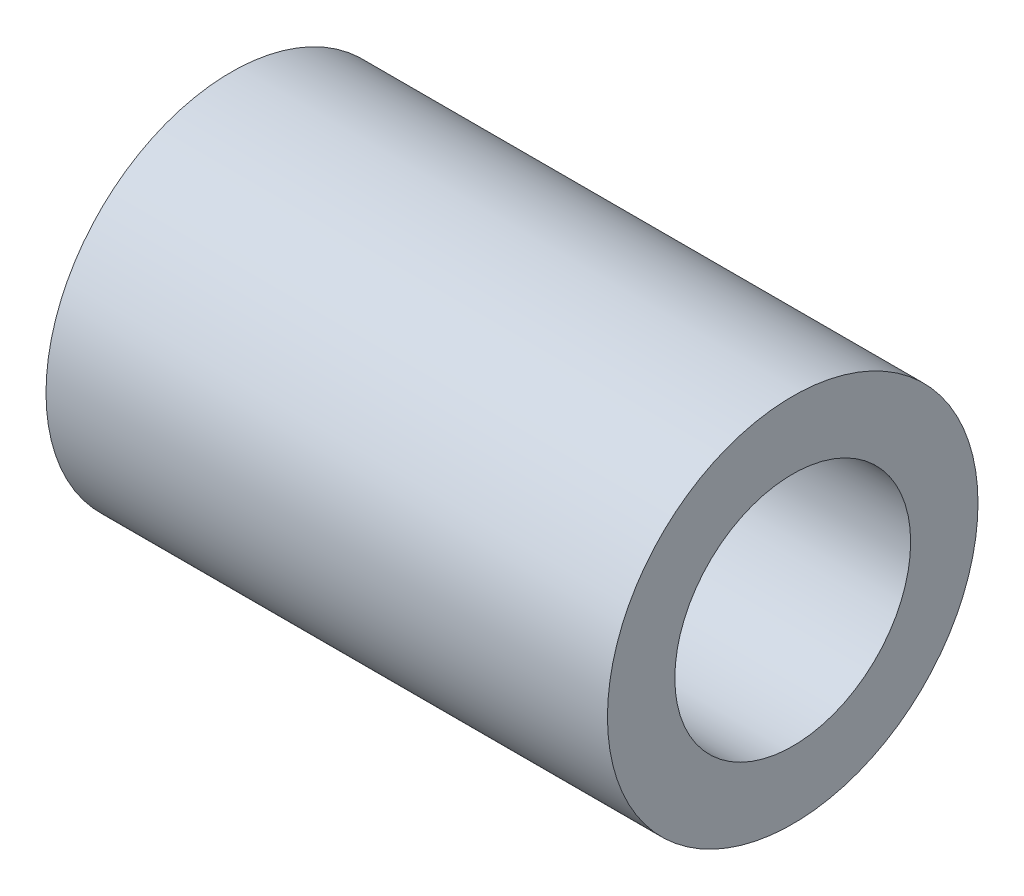
ISO-10303-21;
HEADER;
FILE_DESCRIPTION(('STEP AP214'),'2;1');
FILE_NAME('part.step','',(''),(''),'','','');
FILE_SCHEMA(('AUTOMOTIVE_DESIGN { 1 0 10303 214 1 1 1 1 }'));
ENDSEC;
DATA;
#1=APPLICATION_CONTEXT('core data for automotive mechanical design processes');
#2=APPLICATION_PROTOCOL_DEFINITION('international standard','automotive_design',2000,#1);
#3=PRODUCT_CONTEXT('',#1,'mechanical');
#4=PRODUCT('Part','Part','',(#3));
#5=PRODUCT_RELATED_PRODUCT_CATEGORY('part','',(#4));
#6=PRODUCT_DEFINITION_FORMATION('','',#4);
#7=PRODUCT_DEFINITION_CONTEXT('part definition',#1,'design');
#8=PRODUCT_DEFINITION('design','',#6,#7);
#9=PRODUCT_DEFINITION_SHAPE('','',#8);
#10=(LENGTH_UNIT() NAMED_UNIT(*) SI_UNIT(.MILLI.,.METRE.));
#11=(NAMED_UNIT(*) PLANE_ANGLE_UNIT() SI_UNIT($,.RADIAN.));
#12=(NAMED_UNIT(*) SI_UNIT($,.STERADIAN.) SOLID_ANGLE_UNIT());
#13=UNCERTAINTY_MEASURE_WITH_UNIT(LENGTH_MEASURE(1.E-05),#10,'distance_accuracy_value','');
#14=(GEOMETRIC_REPRESENTATION_CONTEXT(3) GLOBAL_UNCERTAINTY_ASSIGNED_CONTEXT((#13)) GLOBAL_UNIT_ASSIGNED_CONTEXT((#10,
#11,#12)) REPRESENTATION_CONTEXT('',''));
#15=CARTESIAN_POINT('',(0.,0.,0.));
#16=DIRECTION('',(0.,0.,1.));
#17=DIRECTION('',(1.,0.,0.));
#18=AXIS2_PLACEMENT_3D('',#15,#16,#17);
#19=CARTESIAN_POINT('',(10.,0.,0.));
#20=DIRECTION('',(1.,0.,0.));
#21=DIRECTION('',(0.,0.,-1.));
#22=AXIS2_PLACEMENT_3D('',#19,#20,#21);
#23=PLANE('',#22);
#24=CARTESIAN_POINT('',(10.,0.,0.));
#25=DIRECTION('',(1.,0.,0.));
#26=DIRECTION('',(0.,0.,-1.));
#27=AXIS2_PLACEMENT_3D('',#24,#25,#26);
#28=CIRCLE('',#27,3.3);
#29=CARTESIAN_POINT('',(10.,0.,-3.3));
#30=VERTEX_POINT('',#29);
#31=EDGE_CURVE('E10',#30,#30,#28,.T.);
#32=ORIENTED_EDGE('',*,*,#31,.T.);
#33=EDGE_LOOP('',(#32));
#34=FACE_BOUND('',#33,.T.);
#35=CARTESIAN_POINT('',(10.,0.,0.));
#36=DIRECTION('',(1.,0.,0.));
#37=DIRECTION('',(0.,0.,-1.));
#38=AXIS2_PLACEMENT_3D('',#35,#36,#37);
#39=CIRCLE('',#38,2.1);
#40=CARTESIAN_POINT('',(10.,0.,-2.1));
#41=VERTEX_POINT('',#40);
#42=EDGE_CURVE('E41',#41,#41,#39,.T.);
#43=ORIENTED_EDGE('',*,*,#42,.F.);
#44=EDGE_LOOP('',(#43));
#45=FACE_BOUND('',#44,.T.);
#46=ADVANCED_FACE('F30',(#34,#45),#23,.T.);
#47=CARTESIAN_POINT('',(0.,0.,0.));
#48=DIRECTION('',(1.,0.,0.));
#49=DIRECTION('',(0.,0.,-1.));
#50=AXIS2_PLACEMENT_3D('',#47,#48,#49);
#51=PLANE('',#50);
#52=CARTESIAN_POINT('',(0.,0.,0.));
#53=DIRECTION('',(1.,0.,0.));
#54=DIRECTION('',(0.,0.,-1.));
#55=AXIS2_PLACEMENT_3D('',#52,#53,#54);
#56=CIRCLE('',#55,3.3);
#57=CARTESIAN_POINT('',(0.,0.,-3.3));
#58=VERTEX_POINT('',#57);
#59=EDGE_CURVE('E34',#58,#58,#56,.T.);
#60=ORIENTED_EDGE('',*,*,#59,.F.);
#61=EDGE_LOOP('',(#60));
#62=FACE_BOUND('',#61,.T.);
#63=CARTESIAN_POINT('',(0.,0.,0.));
#64=DIRECTION('',(1.,0.,0.));
#65=DIRECTION('',(0.,0.,-1.));
#66=AXIS2_PLACEMENT_3D('',#63,#64,#65);
#67=CIRCLE('',#66,2.1);
#68=CARTESIAN_POINT('',(0.,0.,-2.1));
#69=VERTEX_POINT('',#68);
#70=EDGE_CURVE('E43',#69,#69,#67,.T.);
#71=ORIENTED_EDGE('',*,*,#70,.T.);
#72=EDGE_LOOP('',(#71));
#73=FACE_BOUND('',#72,.T.);
#74=ADVANCED_FACE('F53',(#62,#73),#51,.F.);
#75=CARTESIAN_POINT('',(10.,0.,0.));
#76=DIRECTION('',(-1.,0.,0.));
#77=DIRECTION('',(0.,0.,1.));
#78=AXIS2_PLACEMENT_3D('',#75,#76,#77);
#79=CYLINDRICAL_SURFACE('',#78,3.3);
#80=ORIENTED_EDGE('',*,*,#31,.F.);
#81=EDGE_LOOP('',(#80));
#82=FACE_BOUND('',#81,.T.);
#83=ORIENTED_EDGE('',*,*,#59,.T.);
#84=EDGE_LOOP('',(#83));
#85=FACE_BOUND('',#84,.T.);
#86=ADVANCED_FACE('F32',(#82,#85),#79,.T.);
#87=CARTESIAN_POINT('',(10.,0.,0.));
#88=DIRECTION('',(-1.,0.,0.));
#89=DIRECTION('',(0.,0.,1.));
#90=AXIS2_PLACEMENT_3D('',#87,#88,#89);
#91=CYLINDRICAL_SURFACE('',#90,2.1);
#92=ORIENTED_EDGE('',*,*,#42,.T.);
#93=EDGE_LOOP('',(#92));
#94=FACE_BOUND('',#93,.T.);
#95=ORIENTED_EDGE('',*,*,#70,.F.);
#96=EDGE_LOOP('',(#95));
#97=FACE_BOUND('',#96,.T.);
#98=ADVANCED_FACE('F49',(#94,#97),#91,.F.);
#99=CLOSED_SHELL('',(#46,#74,#86,#98));
#100=MANIFOLD_SOLID_BREP('B2',#99);
#101=ADVANCED_BREP_SHAPE_REPRESENTATION('',(#18,#100),#14);
#102=SHAPE_DEFINITION_REPRESENTATION(#9,#101);
ENDSEC;
END-ISO-10303-21;
